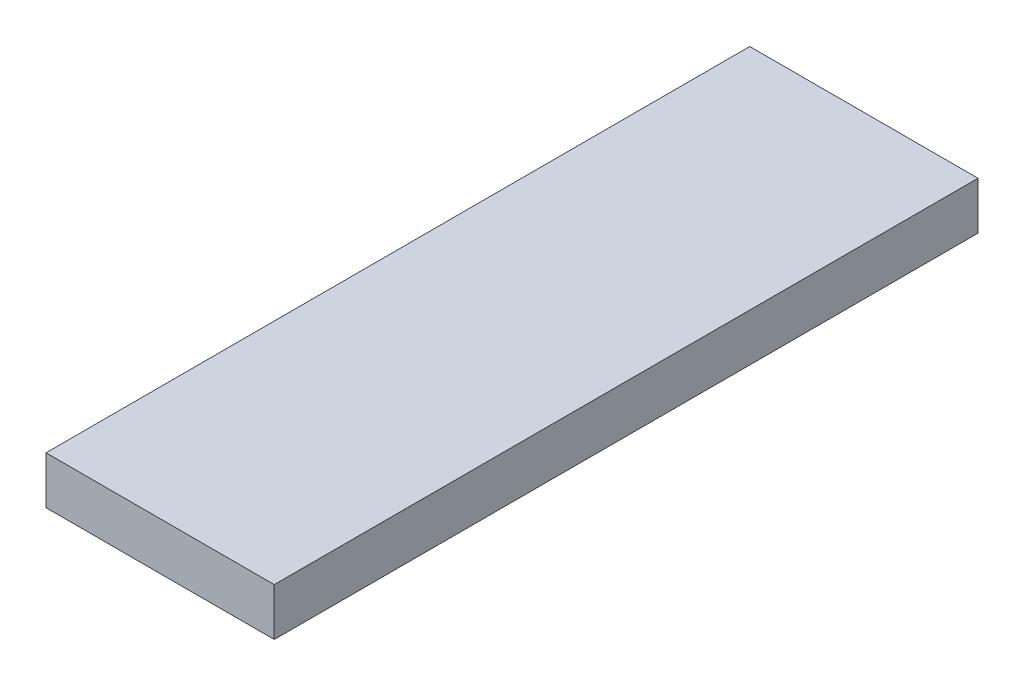
ISO-10303-21;
HEADER;
FILE_DESCRIPTION(('STEP AP214'),'2;1');
FILE_NAME('part.step','',(''),(''),'','','');
FILE_SCHEMA(('AUTOMOTIVE_DESIGN { 1 0 10303 214 1 1 1 1 }'));
ENDSEC;
DATA;
#1=APPLICATION_CONTEXT('core data for automotive mechanical design processes');
#2=APPLICATION_PROTOCOL_DEFINITION('international standard','automotive_design',2000,#1);
#3=PRODUCT_CONTEXT('',#1,'mechanical');
#4=PRODUCT('Part','Part','',(#3));
#5=PRODUCT_RELATED_PRODUCT_CATEGORY('part','',(#4));
#6=PRODUCT_DEFINITION_FORMATION('','',#4);
#7=PRODUCT_DEFINITION_CONTEXT('part definition',#1,'design');
#8=PRODUCT_DEFINITION('design','',#6,#7);
#9=PRODUCT_DEFINITION_SHAPE('','',#8);
#10=(LENGTH_UNIT() NAMED_UNIT(*) SI_UNIT(.MILLI.,.METRE.));
#11=(NAMED_UNIT(*) PLANE_ANGLE_UNIT() SI_UNIT($,.RADIAN.));
#12=(NAMED_UNIT(*) SI_UNIT($,.STERADIAN.) SOLID_ANGLE_UNIT());
#13=UNCERTAINTY_MEASURE_WITH_UNIT(LENGTH_MEASURE(1.E-05),#10,'distance_accuracy_value','');
#14=(GEOMETRIC_REPRESENTATION_CONTEXT(3) GLOBAL_UNCERTAINTY_ASSIGNED_CONTEXT((#13)) GLOBAL_UNIT_ASSIGNED_CONTEXT((#10,
#11,#12)) REPRESENTATION_CONTEXT('',''));
#15=CARTESIAN_POINT('',(0.,0.,0.));
#16=DIRECTION('',(0.,0.,1.));
#17=DIRECTION('',(1.,0.,0.));
#18=AXIS2_PLACEMENT_3D('',#15,#16,#17);
#19=CARTESIAN_POINT('',(12.5480769230769,2.5,10.5307692307692));
#20=DIRECTION('',(1.,0.,0.));
#21=DIRECTION('',(0.,0.,-1.));
#22=AXIS2_PLACEMENT_3D('',#19,#20,#21);
#23=PLANE('',#22);
#24=DIRECTION('',(0.,0.,1.));
#25=VECTOR('',#24,1.);
#26=CARTESIAN_POINT('',(12.5480769230769,0.,10.5307692307692));
#27=LINE('',#26,#25);
#28=CARTESIAN_POINT('',(12.5480769230769,0.,-26.4692307692308));
#29=VERTEX_POINT('',#28);
#30=CARTESIAN_POINT('',(12.5480769230769,0.,10.5307692307692));
#31=VERTEX_POINT('',#30);
#32=EDGE_CURVE('E96',#29,#31,#27,.T.);
#33=ORIENTED_EDGE('',*,*,#32,.T.);
#34=DIRECTION('',(0.,-1.,0.));
#35=VECTOR('',#34,1.);
#36=CARTESIAN_POINT('',(12.5480769230769,2.5,10.5307692307692));
#37=LINE('',#36,#35);
#38=CARTESIAN_POINT('',(12.5480769230769,2.5,10.5307692307692));
#39=VERTEX_POINT('',#38);
#40=EDGE_CURVE('E11',#39,#31,#37,.T.);
#41=ORIENTED_EDGE('',*,*,#40,.F.);
#42=DIRECTION('',(0.,0.,1.));
#43=VECTOR('',#42,1.);
#44=CARTESIAN_POINT('',(12.5480769230769,2.5,10.5307692307692));
#45=LINE('',#44,#43);
#46=CARTESIAN_POINT('',(12.5480769230769,2.5,-26.4692307692308));
#47=VERTEX_POINT('',#46);
#48=EDGE_CURVE('E84',#47,#39,#45,.T.);
#49=ORIENTED_EDGE('',*,*,#48,.F.);
#50=DIRECTION('',(0.,-1.,0.));
#51=VECTOR('',#50,1.);
#52=CARTESIAN_POINT('',(12.5480769230769,2.5,-26.4692307692308));
#53=LINE('',#52,#51);
#54=EDGE_CURVE('E92',#47,#29,#53,.T.);
#55=ORIENTED_EDGE('',*,*,#54,.T.);
#56=EDGE_LOOP('',(#33,#41,#49,#55));
#57=FACE_BOUND('',#56,.T.);
#58=ADVANCED_FACE('F33',(#57),#23,.F.);
#59=CARTESIAN_POINT('',(12.5480769230769,2.5,10.5307692307692));
#60=DIRECTION('',(0.,0.,-1.));
#61=DIRECTION('',(-1.,0.,0.));
#62=AXIS2_PLACEMENT_3D('',#59,#60,#61);
#63=PLANE('',#62);
#64=DIRECTION('',(1.,0.,0.));
#65=VECTOR('',#64,1.);
#66=CARTESIAN_POINT('',(12.5480769230769,0.,10.5307692307692));
#67=LINE('',#66,#65);
#68=CARTESIAN_POINT('',(24.5480769230769,0.,10.5307692307692));
#69=VERTEX_POINT('',#68);
#70=EDGE_CURVE('E88',#31,#69,#67,.T.);
#71=ORIENTED_EDGE('',*,*,#70,.T.);
#72=DIRECTION('',(0.,-1.,0.));
#73=VECTOR('',#72,1.);
#74=CARTESIAN_POINT('',(24.5480769230769,2.5,10.5307692307692));
#75=LINE('',#74,#73);
#76=CARTESIAN_POINT('',(24.5480769230769,2.5,10.5307692307692));
#77=VERTEX_POINT('',#76);
#78=EDGE_CURVE('E41',#77,#69,#75,.T.);
#79=ORIENTED_EDGE('',*,*,#78,.F.);
#80=DIRECTION('',(1.,0.,0.));
#81=VECTOR('',#80,1.);
#82=CARTESIAN_POINT('',(12.5480769230769,2.5,10.5307692307692));
#83=LINE('',#82,#81);
#84=EDGE_CURVE('E79',#39,#77,#83,.T.);
#85=ORIENTED_EDGE('',*,*,#84,.F.);
#86=ORIENTED_EDGE('',*,*,#40,.T.);
#87=EDGE_LOOP('',(#71,#79,#85,#86));
#88=FACE_BOUND('',#87,.T.);
#89=ADVANCED_FACE('F87',(#88),#63,.F.);
#90=CARTESIAN_POINT('',(24.5480769230769,2.5,10.5307692307692));
#91=DIRECTION('',(-1.,0.,0.));
#92=DIRECTION('',(0.,0.,1.));
#93=AXIS2_PLACEMENT_3D('',#90,#91,#92);
#94=PLANE('',#93);
#95=DIRECTION('',(0.,0.,-1.));
#96=VECTOR('',#95,1.);
#97=CARTESIAN_POINT('',(24.5480769230769,0.,10.5307692307692));
#98=LINE('',#97,#96);
#99=CARTESIAN_POINT('',(24.5480769230769,0.,-26.4692307692308));
#100=VERTEX_POINT('',#99);
#101=EDGE_CURVE('E66',#69,#100,#98,.T.);
#102=ORIENTED_EDGE('',*,*,#101,.T.);
#103=DIRECTION('',(0.,-1.,0.));
#104=VECTOR('',#103,1.);
#105=CARTESIAN_POINT('',(24.5480769230769,2.5,-26.4692307692308));
#106=LINE('',#105,#104);
#107=CARTESIAN_POINT('',(24.5480769230769,2.5,-26.4692307692308));
#108=VERTEX_POINT('',#107);
#109=EDGE_CURVE('E89',#108,#100,#106,.T.);
#110=ORIENTED_EDGE('',*,*,#109,.F.);
#111=DIRECTION('',(0.,0.,-1.));
#112=VECTOR('',#111,1.);
#113=CARTESIAN_POINT('',(24.5480769230769,2.5,10.5307692307692));
#114=LINE('',#113,#112);
#115=EDGE_CURVE('E82',#77,#108,#114,.T.);
#116=ORIENTED_EDGE('',*,*,#115,.F.);
#117=ORIENTED_EDGE('',*,*,#78,.T.);
#118=EDGE_LOOP('',(#102,#110,#116,#117));
#119=FACE_BOUND('',#118,.T.);
#120=ADVANCED_FACE('F90',(#119),#94,.F.);
#121=CARTESIAN_POINT('',(12.5480769230769,2.5,-26.4692307692308));
#122=DIRECTION('',(0.,0.,1.));
#123=DIRECTION('',(1.,0.,0.));
#124=AXIS2_PLACEMENT_3D('',#121,#122,#123);
#125=PLANE('',#124);
#126=DIRECTION('',(-1.,0.,0.));
#127=VECTOR('',#126,1.);
#128=CARTESIAN_POINT('',(12.5480769230769,0.,-26.4692307692308));
#129=LINE('',#128,#127);
#130=EDGE_CURVE('E72',#100,#29,#129,.T.);
#131=ORIENTED_EDGE('',*,*,#130,.T.);
#132=ORIENTED_EDGE('',*,*,#54,.F.);
#133=DIRECTION('',(-1.,0.,0.));
#134=VECTOR('',#133,1.);
#135=CARTESIAN_POINT('',(12.5480769230769,2.5,-26.4692307692308));
#136=LINE('',#135,#134);
#137=EDGE_CURVE('E49',#108,#47,#136,.T.);
#138=ORIENTED_EDGE('',*,*,#137,.F.);
#139=ORIENTED_EDGE('',*,*,#109,.T.);
#140=EDGE_LOOP('',(#131,#132,#138,#139));
#141=FACE_BOUND('',#140,.T.);
#142=ADVANCED_FACE('F103',(#141),#125,.F.);
#143=CARTESIAN_POINT('',(0.,2.5,0.));
#144=DIRECTION('',(0.,-1.,0.));
#145=DIRECTION('',(0.,0.,-1.));
#146=AXIS2_PLACEMENT_3D('',#143,#144,#145);
#147=PLANE('',#146);
#148=ORIENTED_EDGE('',*,*,#48,.T.);
#149=ORIENTED_EDGE('',*,*,#84,.T.);
#150=ORIENTED_EDGE('',*,*,#115,.T.);
#151=ORIENTED_EDGE('',*,*,#137,.T.);
#152=EDGE_LOOP('',(#148,#149,#150,#151));
#153=FACE_BOUND('',#152,.T.);
#154=ADVANCED_FACE('F80',(#153),#147,.F.);
#155=CARTESIAN_POINT('',(0.,0.,0.));
#156=DIRECTION('',(0.,-1.,0.));
#157=DIRECTION('',(0.,0.,-1.));
#158=AXIS2_PLACEMENT_3D('',#155,#156,#157);
#159=PLANE('',#158);
#160=ORIENTED_EDGE('',*,*,#32,.F.);
#161=ORIENTED_EDGE('',*,*,#130,.F.);
#162=ORIENTED_EDGE('',*,*,#101,.F.);
#163=ORIENTED_EDGE('',*,*,#70,.F.);
#164=EDGE_LOOP('',(#160,#161,#162,#163));
#165=FACE_BOUND('',#164,.T.);
#166=ADVANCED_FACE('F106',(#165),#159,.T.);
#167=CLOSED_SHELL('',(#58,#89,#120,#142,#154,#166));
#168=MANIFOLD_SOLID_BREP('B2',#167);
#169=ADVANCED_BREP_SHAPE_REPRESENTATION('',(#18,#168),#14);
#170=SHAPE_DEFINITION_REPRESENTATION(#9,#169);
ENDSEC;
END-ISO-10303-21;
